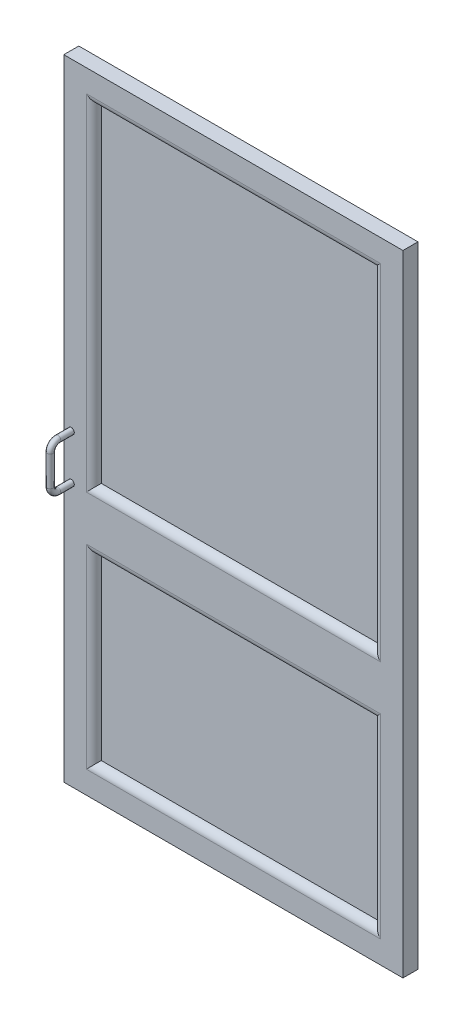
ISO-10303-21;
HEADER;
FILE_DESCRIPTION(('STEP AP214'),'2;1');
FILE_NAME('part.step','',(''),(''),'','','');
FILE_SCHEMA(('AUTOMOTIVE_DESIGN { 1 0 10303 214 1 1 1 1 }'));
ENDSEC;
DATA;
#1=APPLICATION_CONTEXT('core data for automotive mechanical design processes');
#2=APPLICATION_PROTOCOL_DEFINITION('international standard','automotive_design',2000,#1);
#3=PRODUCT_CONTEXT('',#1,'mechanical');
#4=PRODUCT('Part','Part','',(#3));
#5=PRODUCT_RELATED_PRODUCT_CATEGORY('part','',(#4));
#6=PRODUCT_DEFINITION_FORMATION('','',#4);
#7=PRODUCT_DEFINITION_CONTEXT('part definition',#1,'design');
#8=PRODUCT_DEFINITION('design','',#6,#7);
#9=PRODUCT_DEFINITION_SHAPE('','',#8);
#10=(LENGTH_UNIT() NAMED_UNIT(*) SI_UNIT(.MILLI.,.METRE.));
#11=(NAMED_UNIT(*) PLANE_ANGLE_UNIT() SI_UNIT($,.RADIAN.));
#12=(NAMED_UNIT(*) SI_UNIT($,.STERADIAN.) SOLID_ANGLE_UNIT());
#13=UNCERTAINTY_MEASURE_WITH_UNIT(LENGTH_MEASURE(1.E-05),#10,'distance_accuracy_value','');
#14=(GEOMETRIC_REPRESENTATION_CONTEXT(3) GLOBAL_UNCERTAINTY_ASSIGNED_CONTEXT((#13)) GLOBAL_UNIT_ASSIGNED_CONTEXT((#10,
#11,#12)) REPRESENTATION_CONTEXT('',''));
#15=CARTESIAN_POINT('',(0.,0.,0.));
#16=DIRECTION('',(0.,0.,1.));
#17=DIRECTION('',(1.,0.,0.));
#18=AXIS2_PLACEMENT_3D('',#15,#16,#17);
#19=CARTESIAN_POINT('',(0.,0.,4.));
#20=DIRECTION('',(0.,0.,-1.));
#21=DIRECTION('',(-1.,0.,0.));
#22=AXIS2_PLACEMENT_3D('',#19,#20,#21);
#23=PLANE('',#22);
#24=DIRECTION('',(0.,-1.,0.));
#25=VECTOR('',#24,1.);
#26=CARTESIAN_POINT('',(0.,0.,4.));
#27=LINE('',#26,#25);
#28=CARTESIAN_POINT('',(0.,168.,4.));
#29=VERTEX_POINT('',#28);
#30=CARTESIAN_POINT('',(0.,0.,4.));
#31=VERTEX_POINT('',#30);
#32=EDGE_CURVE('E164',#29,#31,#27,.T.);
#33=ORIENTED_EDGE('',*,*,#32,.T.);
#34=DIRECTION('',(1.,0.,0.));
#35=VECTOR('',#34,1.);
#36=CARTESIAN_POINT('',(0.,0.,4.));
#37=LINE('',#36,#35);
#38=CARTESIAN_POINT('',(90.4342659726487,0.,4.));
#39=VERTEX_POINT('',#38);
#40=EDGE_CURVE('E167',#31,#39,#37,.T.);
#41=ORIENTED_EDGE('',*,*,#40,.T.);
#42=DIRECTION('',(0.,1.,0.));
#43=VECTOR('',#42,1.);
#44=CARTESIAN_POINT('',(90.4342659726487,0.,4.));
#45=LINE('',#44,#43);
#46=CARTESIAN_POINT('',(90.4342659726487,168.,4.));
#47=VERTEX_POINT('',#46);
#48=EDGE_CURVE('E170',#39,#47,#45,.T.);
#49=ORIENTED_EDGE('',*,*,#48,.T.);
#50=DIRECTION('',(-1.,0.,0.));
#51=VECTOR('',#50,1.);
#52=CARTESIAN_POINT('',(0.,168.,4.));
#53=LINE('',#52,#51);
#54=EDGE_CURVE('E172',#47,#29,#53,.T.);
#55=ORIENTED_EDGE('',*,*,#54,.T.);
#56=EDGE_LOOP('',(#33,#41,#49,#55));
#57=FACE_BOUND('',#56,.T.);
#58=DIRECTION('',(1.,0.,0.));
#59=VECTOR('',#58,1.);
#60=CARTESIAN_POINT('',(0.,70.,4.));
#61=LINE('',#60,#59);
#62=CARTESIAN_POINT('',(84.4342659726486,70.,4.));
#63=VERTEX_POINT('',#62);
#64=CARTESIAN_POINT('',(6.,70.,4.));
#65=VERTEX_POINT('',#64);
#66=EDGE_CURVE('E197',#63,#65,#61,.F.);
#67=ORIENTED_EDGE('',*,*,#66,.T.);
#68=DIRECTION('',(0.,-1.,0.));
#69=VECTOR('',#68,1.);
#70=CARTESIAN_POINT('',(6.00000000000001,0.,4.));
#71=LINE('',#70,#69);
#72=CARTESIAN_POINT('',(5.99999999999999,162.,4.));
#73=VERTEX_POINT('',#72);
#74=EDGE_CURVE('E199',#65,#73,#71,.F.);
#75=ORIENTED_EDGE('',*,*,#74,.T.);
#76=DIRECTION('',(-1.,0.,0.));
#77=VECTOR('',#76,1.);
#78=CARTESIAN_POINT('',(0.,162.,4.));
#79=LINE('',#78,#77);
#80=CARTESIAN_POINT('',(84.4342659726486,162.,4.));
#81=VERTEX_POINT('',#80);
#82=EDGE_CURVE('E193',#73,#81,#79,.F.);
#83=ORIENTED_EDGE('',*,*,#82,.T.);
#84=DIRECTION('',(0.,1.,0.));
#85=VECTOR('',#84,1.);
#86=CARTESIAN_POINT('',(84.4342659726487,0.,4.));
#87=LINE('',#86,#85);
#88=EDGE_CURVE('E195',#81,#63,#87,.F.);
#89=ORIENTED_EDGE('',*,*,#88,.T.);
#90=EDGE_LOOP('',(#67,#75,#83,#89));
#91=FACE_BOUND('',#90,.T.);
#92=DIRECTION('',(0.,1.,0.));
#93=VECTOR('',#92,1.);
#94=CARTESIAN_POINT('',(84.4342659726486,0.,4.));
#95=LINE('',#94,#93);
#96=CARTESIAN_POINT('',(84.4342659726486,58.,4.));
#97=VERTEX_POINT('',#96);
#98=CARTESIAN_POINT('',(84.4342659726486,6.,4.));
#99=VERTEX_POINT('',#98);
#100=EDGE_CURVE('E62',#97,#99,#95,.F.);
#101=ORIENTED_EDGE('',*,*,#100,.T.);
#102=DIRECTION('',(1.,0.,0.));
#103=VECTOR('',#102,1.);
#104=CARTESIAN_POINT('',(0.,6.,4.));
#105=LINE('',#104,#103);
#106=CARTESIAN_POINT('',(6.00000000000001,6.,4.));
#107=VERTEX_POINT('',#106);
#108=EDGE_CURVE('E46',#99,#107,#105,.F.);
#109=ORIENTED_EDGE('',*,*,#108,.T.);
#110=DIRECTION('',(0.,-1.,0.));
#111=VECTOR('',#110,1.);
#112=CARTESIAN_POINT('',(6.00000000000001,0.,4.));
#113=LINE('',#112,#111);
#114=CARTESIAN_POINT('',(6.,58.,4.));
#115=VERTEX_POINT('',#114);
#116=EDGE_CURVE('E141',#107,#115,#113,.F.);
#117=ORIENTED_EDGE('',*,*,#116,.T.);
#118=DIRECTION('',(-1.,0.,0.));
#119=VECTOR('',#118,1.);
#120=CARTESIAN_POINT('',(0.,58.,4.));
#121=LINE('',#120,#119);
#122=EDGE_CURVE('E202',#115,#97,#121,.F.);
#123=ORIENTED_EDGE('',*,*,#122,.T.);
#124=EDGE_LOOP('',(#101,#109,#117,#123));
#125=FACE_BOUND('',#124,.T.);
#126=CARTESIAN_POINT('',(2.,70.1108439341889,4.));
#127=DIRECTION('',(0.,0.,-1.));
#128=DIRECTION('',(-1.,0.,0.));
#129=AXIS2_PLACEMENT_3D('',#126,#127,#128);
#130=CIRCLE('',#129,0.8);
#131=CARTESIAN_POINT('',(1.2,70.1108439341889,4.));
#132=VERTEX_POINT('',#131);
#133=EDGE_CURVE('E41',#132,#132,#130,.T.);
#134=ORIENTED_EDGE('',*,*,#133,.T.);
#135=EDGE_LOOP('',(#134));
#136=FACE_BOUND('',#135,.T.);
#137=CARTESIAN_POINT('',(2.,82.1108439341888,4.));
#138=DIRECTION('',(0.,0.,1.));
#139=DIRECTION('',(1.,0.,0.));
#140=AXIS2_PLACEMENT_3D('',#137,#138,#139);
#141=CIRCLE('',#140,0.8);
#142=CARTESIAN_POINT('',(2.8,82.1108439341888,4.));
#143=VERTEX_POINT('',#142);
#144=EDGE_CURVE('E11',#143,#143,#141,.T.);
#145=ORIENTED_EDGE('',*,*,#144,.F.);
#146=EDGE_LOOP('',(#145));
#147=FACE_BOUND('',#146,.T.);
#148=ADVANCED_FACE('F37',(#57,#91,#125,#136,#147),#23,.F.);
#149=CARTESIAN_POINT('',(0.,0.,4.));
#150=DIRECTION('',(1.,0.,0.));
#151=DIRECTION('',(0.,0.,-1.));
#152=AXIS2_PLACEMENT_3D('',#149,#150,#151);
#153=PLANE('',#152);
#154=DIRECTION('',(0.,-1.,0.));
#155=VECTOR('',#154,1.);
#156=CARTESIAN_POINT('',(0.,0.,0.));
#157=LINE('',#156,#155);
#158=CARTESIAN_POINT('',(0.,168.,0.));
#159=VERTEX_POINT('',#158);
#160=CARTESIAN_POINT('',(0.,0.,0.));
#161=VERTEX_POINT('',#160);
#162=EDGE_CURVE('E154',#159,#161,#157,.T.);
#163=ORIENTED_EDGE('',*,*,#162,.T.);
#164=DIRECTION('',(0.,0.,-1.));
#165=VECTOR('',#164,1.);
#166=CARTESIAN_POINT('',(0.,0.,4.));
#167=LINE('',#166,#165);
#168=EDGE_CURVE('E190',#31,#161,#167,.T.);
#169=ORIENTED_EDGE('',*,*,#168,.F.);
#170=ORIENTED_EDGE('',*,*,#32,.F.);
#171=DIRECTION('',(0.,0.,-1.));
#172=VECTOR('',#171,1.);
#173=CARTESIAN_POINT('',(0.,168.,4.));
#174=LINE('',#173,#172);
#175=EDGE_CURVE('E174',#29,#159,#174,.T.);
#176=ORIENTED_EDGE('',*,*,#175,.T.);
#177=EDGE_LOOP('',(#163,#169,#170,#176));
#178=FACE_BOUND('',#177,.T.);
#179=ADVANCED_FACE('F255',(#178),#153,.F.);
#180=CARTESIAN_POINT('',(0.,0.,4.));
#181=DIRECTION('',(0.,1.,0.));
#182=DIRECTION('',(0.,0.,1.));
#183=AXIS2_PLACEMENT_3D('',#180,#181,#182);
#184=PLANE('',#183);
#185=DIRECTION('',(1.,0.,0.));
#186=VECTOR('',#185,1.);
#187=CARTESIAN_POINT('',(0.,0.,0.));
#188=LINE('',#187,#186);
#189=CARTESIAN_POINT('',(90.4342659726487,0.,0.));
#190=VERTEX_POINT('',#189);
#191=EDGE_CURVE('E177',#161,#190,#188,.T.);
#192=ORIENTED_EDGE('',*,*,#191,.T.);
#193=DIRECTION('',(0.,0.,-1.));
#194=VECTOR('',#193,1.);
#195=CARTESIAN_POINT('',(90.4342659726487,0.,4.));
#196=LINE('',#195,#194);
#197=EDGE_CURVE('E187',#39,#190,#196,.T.);
#198=ORIENTED_EDGE('',*,*,#197,.F.);
#199=ORIENTED_EDGE('',*,*,#40,.F.);
#200=ORIENTED_EDGE('',*,*,#168,.T.);
#201=EDGE_LOOP('',(#192,#198,#199,#200));
#202=FACE_BOUND('',#201,.T.);
#203=ADVANCED_FACE('F260',(#202),#184,.F.);
#204=CARTESIAN_POINT('',(90.4342659726487,0.,4.));
#205=DIRECTION('',(-1.,0.,0.));
#206=DIRECTION('',(0.,0.,1.));
#207=AXIS2_PLACEMENT_3D('',#204,#205,#206);
#208=PLANE('',#207);
#209=DIRECTION('',(0.,1.,0.));
#210=VECTOR('',#209,1.);
#211=CARTESIAN_POINT('',(90.4342659726487,0.,0.));
#212=LINE('',#211,#210);
#213=CARTESIAN_POINT('',(90.4342659726487,168.,0.));
#214=VERTEX_POINT('',#213);
#215=EDGE_CURVE('E179',#190,#214,#212,.T.);
#216=ORIENTED_EDGE('',*,*,#215,.T.);
#217=DIRECTION('',(0.,0.,-1.));
#218=VECTOR('',#217,1.);
#219=CARTESIAN_POINT('',(90.4342659726487,168.,4.));
#220=LINE('',#219,#218);
#221=EDGE_CURVE('E184',#47,#214,#220,.T.);
#222=ORIENTED_EDGE('',*,*,#221,.F.);
#223=ORIENTED_EDGE('',*,*,#48,.F.);
#224=ORIENTED_EDGE('',*,*,#197,.T.);
#225=EDGE_LOOP('',(#216,#222,#223,#224));
#226=FACE_BOUND('',#225,.T.);
#227=ADVANCED_FACE('F266',(#226),#208,.F.);
#228=CARTESIAN_POINT('',(0.,168.,4.));
#229=DIRECTION('',(0.,-1.,0.));
#230=DIRECTION('',(0.,0.,-1.));
#231=AXIS2_PLACEMENT_3D('',#228,#229,#230);
#232=PLANE('',#231);
#233=DIRECTION('',(-1.,0.,0.));
#234=VECTOR('',#233,1.);
#235=CARTESIAN_POINT('',(0.,168.,0.));
#236=LINE('',#235,#234);
#237=EDGE_CURVE('E168',#214,#159,#236,.T.);
#238=ORIENTED_EDGE('',*,*,#237,.T.);
#239=ORIENTED_EDGE('',*,*,#175,.F.);
#240=ORIENTED_EDGE('',*,*,#54,.F.);
#241=ORIENTED_EDGE('',*,*,#221,.T.);
#242=EDGE_LOOP('',(#238,#239,#240,#241));
#243=FACE_BOUND('',#242,.T.);
#244=ADVANCED_FACE('F250',(#243),#232,.F.);
#245=CARTESIAN_POINT('',(0.,0.,0.));
#246=DIRECTION('',(0.,0.,-1.));
#247=DIRECTION('',(-1.,0.,0.));
#248=AXIS2_PLACEMENT_3D('',#245,#246,#247);
#249=PLANE('',#248);
#250=ORIENTED_EDGE('',*,*,#162,.F.);
#251=ORIENTED_EDGE('',*,*,#237,.F.);
#252=ORIENTED_EDGE('',*,*,#215,.F.);
#253=ORIENTED_EDGE('',*,*,#191,.F.);
#254=EDGE_LOOP('',(#250,#251,#252,#253));
#255=FACE_BOUND('',#254,.T.);
#256=ADVANCED_FACE('F242',(#255),#249,.T.);
#257=CARTESIAN_POINT('',(0.,0.,2.));
#258=DIRECTION('',(0.,0.,1.));
#259=DIRECTION('',(1.,0.,0.));
#260=AXIS2_PLACEMENT_3D('',#257,#258,#259);
#261=PLANE('',#260);
#262=DIRECTION('',(0.,-1.,0.));
#263=VECTOR('',#262,1.);
#264=CARTESIAN_POINT('',(7.99999999999999,160.,2.));
#265=LINE('',#264,#263);
#266=CARTESIAN_POINT('',(7.99999999999999,160.,2.));
#267=VERTEX_POINT('',#266);
#268=CARTESIAN_POINT('',(8.,72.,2.));
#269=VERTEX_POINT('',#268);
#270=EDGE_CURVE('E155',#267,#269,#265,.T.);
#271=ORIENTED_EDGE('',*,*,#270,.T.);
#272=DIRECTION('',(1.,0.,0.));
#273=VECTOR('',#272,1.);
#274=CARTESIAN_POINT('',(8.,72.,2.));
#275=LINE('',#274,#273);
#276=CARTESIAN_POINT('',(82.4342659726486,72.,2.));
#277=VERTEX_POINT('',#276);
#278=EDGE_CURVE('E158',#269,#277,#275,.T.);
#279=ORIENTED_EDGE('',*,*,#278,.T.);
#280=DIRECTION('',(0.,1.,0.));
#281=VECTOR('',#280,1.);
#282=CARTESIAN_POINT('',(82.4342659726486,160.,2.));
#283=LINE('',#282,#281);
#284=CARTESIAN_POINT('',(82.4342659726486,160.,2.));
#285=VERTEX_POINT('',#284);
#286=EDGE_CURVE('E161',#277,#285,#283,.T.);
#287=ORIENTED_EDGE('',*,*,#286,.T.);
#288=DIRECTION('',(-1.,0.,0.));
#289=VECTOR('',#288,1.);
#290=CARTESIAN_POINT('',(7.99999999999999,160.,2.));
#291=LINE('',#290,#289);
#292=EDGE_CURVE('E138',#285,#267,#291,.T.);
#293=ORIENTED_EDGE('',*,*,#292,.T.);
#294=EDGE_LOOP('',(#271,#279,#287,#293));
#295=FACE_BOUND('',#294,.T.);
#296=ADVANCED_FACE('F240',(#295),#261,.T.);
#297=CARTESIAN_POINT('',(0.,0.,2.));
#298=DIRECTION('',(0.,0.,1.));
#299=DIRECTION('',(1.,0.,0.));
#300=AXIS2_PLACEMENT_3D('',#297,#298,#299);
#301=PLANE('',#300);
#302=DIRECTION('',(0.,-1.,0.));
#303=VECTOR('',#302,1.);
#304=CARTESIAN_POINT('',(8.,56.,2.));
#305=LINE('',#304,#303);
#306=CARTESIAN_POINT('',(8.,56.,2.));
#307=VERTEX_POINT('',#306);
#308=CARTESIAN_POINT('',(8.00000000000001,8.,2.));
#309=VERTEX_POINT('',#308);
#310=EDGE_CURVE('E130',#307,#309,#305,.T.);
#311=ORIENTED_EDGE('',*,*,#310,.T.);
#312=DIRECTION('',(1.,0.,0.));
#313=VECTOR('',#312,1.);
#314=CARTESIAN_POINT('',(8.00000000000001,8.,2.));
#315=LINE('',#314,#313);
#316=CARTESIAN_POINT('',(82.4342659726486,8.,2.));
#317=VERTEX_POINT('',#316);
#318=EDGE_CURVE('E132',#309,#317,#315,.T.);
#319=ORIENTED_EDGE('',*,*,#318,.T.);
#320=DIRECTION('',(0.,1.,0.));
#321=VECTOR('',#320,1.);
#322=CARTESIAN_POINT('',(82.4342659726486,56.,2.));
#323=LINE('',#322,#321);
#324=CARTESIAN_POINT('',(82.4342659726486,56.,2.));
#325=VERTEX_POINT('',#324);
#326=EDGE_CURVE('E148',#317,#325,#323,.T.);
#327=ORIENTED_EDGE('',*,*,#326,.T.);
#328=DIRECTION('',(-1.,0.,0.));
#329=VECTOR('',#328,1.);
#330=CARTESIAN_POINT('',(8.,56.,2.));
#331=LINE('',#330,#329);
#332=EDGE_CURVE('E134',#325,#307,#331,.T.);
#333=ORIENTED_EDGE('',*,*,#332,.T.);
#334=EDGE_LOOP('',(#311,#319,#327,#333));
#335=FACE_BOUND('',#334,.T.);
#336=ADVANCED_FACE('F131',(#335),#301,.T.);
#337=CARTESIAN_POINT('',(8.,58.,2.));
#338=DIRECTION('',(-1.,0.,0.));
#339=DIRECTION('',(0.,0.,1.));
#340=AXIS2_PLACEMENT_3D('',#337,#338,#339);
#341=CYLINDRICAL_SURFACE('',#340,2.);
#342=CARTESIAN_POINT('',(84.4342659726486,58.,2.));
#343=DIRECTION('',(-0.707106781186547,0.707106781186547,0.));
#344=DIRECTION('',(0.707106781186547,0.707106781186547,0.));
#345=AXIS2_PLACEMENT_3D('',#342,#343,#344);
#346=ELLIPSE('',#345,2.82842712474619,2.);
#347=EDGE_CURVE('E142',#97,#325,#346,.F.);
#348=ORIENTED_EDGE('',*,*,#347,.F.);
#349=ORIENTED_EDGE('',*,*,#122,.F.);
#350=CARTESIAN_POINT('',(6.,58.,2.));
#351=DIRECTION('',(-0.707106781186547,-0.707106781186548,0.));
#352=DIRECTION('',(0.707106781186547,-0.707106781186547,0.));
#353=AXIS2_PLACEMENT_3D('',#350,#351,#352);
#354=ELLIPSE('',#353,2.82842712474619,2.);
#355=EDGE_CURVE('E159',#307,#115,#354,.T.);
#356=ORIENTED_EDGE('',*,*,#355,.F.);
#357=ORIENTED_EDGE('',*,*,#332,.F.);
#358=EDGE_LOOP('',(#348,#349,#356,#357));
#359=FACE_BOUND('',#358,.T.);
#360=ADVANCED_FACE('F248',(#359),#341,.T.);
#361=CARTESIAN_POINT('',(6.,56.,2.));
#362=DIRECTION('',(0.,-1.,0.));
#363=DIRECTION('',(1.,0.,0.));
#364=AXIS2_PLACEMENT_3D('',#361,#362,#363);
#365=CYLINDRICAL_SURFACE('',#364,2.);
#366=ORIENTED_EDGE('',*,*,#355,.T.);
#367=ORIENTED_EDGE('',*,*,#116,.F.);
#368=CARTESIAN_POINT('',(6.00000000000001,6.,2.));
#369=DIRECTION('',(0.707106781186547,-0.707106781186547,0.));
#370=DIRECTION('',(0.707106781186547,0.707106781186548,0.));
#371=AXIS2_PLACEMENT_3D('',#368,#369,#370);
#372=ELLIPSE('',#371,2.82842712474619,2.);
#373=EDGE_CURVE('E54',#309,#107,#372,.T.);
#374=ORIENTED_EDGE('',*,*,#373,.F.);
#375=ORIENTED_EDGE('',*,*,#310,.F.);
#376=EDGE_LOOP('',(#366,#367,#374,#375));
#377=FACE_BOUND('',#376,.T.);
#378=ADVANCED_FACE('F140',(#377),#365,.T.);
#379=CARTESIAN_POINT('',(84.4342659726486,56.,2.));
#380=DIRECTION('',(0.,1.,0.));
#381=DIRECTION('',(0.,0.,1.));
#382=AXIS2_PLACEMENT_3D('',#379,#380,#381);
#383=CYLINDRICAL_SURFACE('',#382,2.);
#384=ORIENTED_EDGE('',*,*,#347,.T.);
#385=ORIENTED_EDGE('',*,*,#326,.F.);
#386=CARTESIAN_POINT('',(84.4342659726486,6.,2.));
#387=DIRECTION('',(0.707106781186547,0.707106781186547,0.));
#388=DIRECTION('',(0.707106781186547,-0.707106781186547,0.));
#389=AXIS2_PLACEMENT_3D('',#386,#387,#388);
#390=ELLIPSE('',#389,2.82842712474619,2.);
#391=EDGE_CURVE('E143',#99,#317,#390,.F.);
#392=ORIENTED_EDGE('',*,*,#391,.F.);
#393=ORIENTED_EDGE('',*,*,#100,.F.);
#394=EDGE_LOOP('',(#384,#385,#392,#393));
#395=FACE_BOUND('',#394,.T.);
#396=ADVANCED_FACE('F276',(#395),#383,.T.);
#397=CARTESIAN_POINT('',(8.00000000000001,6.,2.));
#398=DIRECTION('',(1.,0.,0.));
#399=DIRECTION('',(0.,0.,-1.));
#400=AXIS2_PLACEMENT_3D('',#397,#398,#399);
#401=CYLINDRICAL_SURFACE('',#400,2.);
#402=ORIENTED_EDGE('',*,*,#373,.T.);
#403=ORIENTED_EDGE('',*,*,#108,.F.);
#404=ORIENTED_EDGE('',*,*,#391,.T.);
#405=ORIENTED_EDGE('',*,*,#318,.F.);
#406=EDGE_LOOP('',(#402,#403,#404,#405));
#407=FACE_BOUND('',#406,.T.);
#408=ADVANCED_FACE('F145',(#407),#401,.T.);
#409=CARTESIAN_POINT('',(84.4342659726486,160.,2.));
#410=DIRECTION('',(0.,1.,0.));
#411=DIRECTION('',(-1.,0.,0.));
#412=AXIS2_PLACEMENT_3D('',#409,#410,#411);
#413=CYLINDRICAL_SURFACE('',#412,2.);
#414=CARTESIAN_POINT('',(84.4342659726486,70.,2.));
#415=DIRECTION('',(0.707106781186547,0.707106781186548,0.));
#416=DIRECTION('',(0.707106781186548,-0.707106781186547,0.));
#417=AXIS2_PLACEMENT_3D('',#414,#415,#416);
#418=ELLIPSE('',#417,2.82842712474619,2.);
#419=EDGE_CURVE('E216',#63,#277,#418,.F.);
#420=ORIENTED_EDGE('',*,*,#419,.F.);
#421=ORIENTED_EDGE('',*,*,#88,.F.);
#422=CARTESIAN_POINT('',(84.4342659726486,162.,2.));
#423=DIRECTION('',(-0.707106781186548,0.707106781186547,0.));
#424=DIRECTION('',(0.707106781186547,0.707106781186548,0.));
#425=AXIS2_PLACEMENT_3D('',#422,#423,#424);
#426=ELLIPSE('',#425,2.82842712474619,2.);
#427=EDGE_CURVE('E207',#285,#81,#426,.T.);
#428=ORIENTED_EDGE('',*,*,#427,.F.);
#429=ORIENTED_EDGE('',*,*,#286,.F.);
#430=EDGE_LOOP('',(#420,#421,#428,#429));
#431=FACE_BOUND('',#430,.T.);
#432=ADVANCED_FACE('F39',(#431),#413,.T.);
#433=CARTESIAN_POINT('',(7.99999999999999,162.,2.));
#434=DIRECTION('',(-1.,0.,0.));
#435=DIRECTION('',(0.,0.,1.));
#436=AXIS2_PLACEMENT_3D('',#433,#434,#435);
#437=CYLINDRICAL_SURFACE('',#436,2.);
#438=ORIENTED_EDGE('',*,*,#427,.T.);
#439=ORIENTED_EDGE('',*,*,#82,.F.);
#440=CARTESIAN_POINT('',(5.99999999999999,162.,2.));
#441=DIRECTION('',(-0.707106781186547,-0.707106781186548,0.));
#442=DIRECTION('',(0.707106781186548,-0.707106781186547,0.));
#443=AXIS2_PLACEMENT_3D('',#440,#441,#442);
#444=ELLIPSE('',#443,2.82842712474619,2.);
#445=EDGE_CURVE('E214',#267,#73,#444,.T.);
#446=ORIENTED_EDGE('',*,*,#445,.F.);
#447=ORIENTED_EDGE('',*,*,#292,.F.);
#448=EDGE_LOOP('',(#438,#439,#446,#447));
#449=FACE_BOUND('',#448,.T.);
#450=ADVANCED_FACE('F223',(#449),#437,.T.);
#451=CARTESIAN_POINT('',(8.,70.,2.));
#452=DIRECTION('',(1.,0.,0.));
#453=DIRECTION('',(0.,0.,-1.));
#454=AXIS2_PLACEMENT_3D('',#451,#452,#453);
#455=CYLINDRICAL_SURFACE('',#454,2.);
#456=ORIENTED_EDGE('',*,*,#419,.T.);
#457=ORIENTED_EDGE('',*,*,#278,.F.);
#458=CARTESIAN_POINT('',(6.,70.,2.));
#459=DIRECTION('',(0.707106781186548,-0.707106781186547,0.));
#460=DIRECTION('',(-0.707106781186547,-0.707106781186548,0.));
#461=AXIS2_PLACEMENT_3D('',#458,#459,#460);
#462=ELLIPSE('',#461,2.82842712474619,2.);
#463=EDGE_CURVE('E212',#65,#269,#462,.F.);
#464=ORIENTED_EDGE('',*,*,#463,.F.);
#465=ORIENTED_EDGE('',*,*,#66,.F.);
#466=EDGE_LOOP('',(#456,#457,#464,#465));
#467=FACE_BOUND('',#466,.T.);
#468=ADVANCED_FACE('F238',(#467),#455,.T.);
#469=CARTESIAN_POINT('',(5.99999999999999,160.,2.));
#470=DIRECTION('',(0.,-1.,0.));
#471=DIRECTION('',(1.,0.,0.));
#472=AXIS2_PLACEMENT_3D('',#469,#470,#471);
#473=CYLINDRICAL_SURFACE('',#472,2.);
#474=ORIENTED_EDGE('',*,*,#445,.T.);
#475=ORIENTED_EDGE('',*,*,#74,.F.);
#476=ORIENTED_EDGE('',*,*,#463,.T.);
#477=ORIENTED_EDGE('',*,*,#270,.F.);
#478=EDGE_LOOP('',(#474,#475,#476,#477));
#479=FACE_BOUND('',#478,.T.);
#480=ADVANCED_FACE('F234',(#479),#473,.T.);
#481=CARTESIAN_POINT('',(2.,70.1108439341889,7.59999999999999));
#482=DIRECTION('',(0.,0.,-1.));
#483=DIRECTION('',(-1.,0.,0.));
#484=AXIS2_PLACEMENT_3D('',#481,#482,#483);
#485=CYLINDRICAL_SURFACE('',#484,0.8);
#486=CARTESIAN_POINT('',(2.,70.1108439341888,7.59999999999999));
#487=DIRECTION('',(0.,0.,-1.));
#488=DIRECTION('',(1.,0.,0.));
#489=AXIS2_PLACEMENT_3D('',#486,#487,#488);
#490=CIRCLE('',#489,0.8);
#491=CARTESIAN_POINT('',(2.,69.3108439341889,7.59999999999998));
#492=VERTEX_POINT('',#491);
#493=EDGE_CURVE('E445',#492,#492,#490,.T.);
#494=ORIENTED_EDGE('',*,*,#493,.T.);
#495=EDGE_LOOP('',(#494));
#496=FACE_BOUND('',#495,.T.);
#497=ORIENTED_EDGE('',*,*,#133,.F.);
#498=EDGE_LOOP('',(#497));
#499=FACE_BOUND('',#498,.T.);
#500=ADVANCED_FACE('F287',(#496,#499),#485,.T.);
#501=CARTESIAN_POINT('',(2.,82.1108439341888,4.));
#502=DIRECTION('',(0.,0.,1.));
#503=DIRECTION('',(1.,0.,0.));
#504=AXIS2_PLACEMENT_3D('',#501,#502,#503);
#505=CYLINDRICAL_SURFACE('',#504,0.8);
#506=CARTESIAN_POINT('',(2.,82.1108439341888,7.59999999999999));
#507=DIRECTION('',(0.,0.,1.));
#508=DIRECTION('',(1.,0.,0.));
#509=AXIS2_PLACEMENT_3D('',#506,#507,#508);
#510=CIRCLE('',#509,0.8);
#511=CARTESIAN_POINT('',(2.,82.9108439341888,7.59999999999998));
#512=VERTEX_POINT('',#511);
#513=EDGE_CURVE('E452',#512,#512,#510,.T.);
#514=ORIENTED_EDGE('',*,*,#513,.F.);
#515=EDGE_LOOP('',(#514));
#516=FACE_BOUND('',#515,.T.);
#517=ORIENTED_EDGE('',*,*,#144,.T.);
#518=EDGE_LOOP('',(#517));
#519=FACE_BOUND('',#518,.T.);
#520=ADVANCED_FACE('F369',(#516,#519),#505,.T.);
#521=CARTESIAN_POINT('',(2.,80.1108439341888,7.6));
#522=DIRECTION('',(1.,0.,0.));
#523=DIRECTION('',(0.,0.,-1.));
#524=AXIS2_PLACEMENT_3D('',#521,#522,#523);
#525=TOROIDAL_SURFACE('',#524,1.99999999999996,0.8);
#526=CARTESIAN_POINT('',(2.,80.1108439341888,9.6));
#527=DIRECTION('',(0.,-1.,0.));
#528=DIRECTION('',(1.,0.,0.));
#529=AXIS2_PLACEMENT_3D('',#526,#527,#528);
#530=CIRCLE('',#529,0.8);
#531=CARTESIAN_POINT('',(2.,80.1108439341888,10.4));
#532=VERTEX_POINT('',#531);
#533=EDGE_CURVE('E449',#532,#532,#530,.T.);
#534=CARTESIAN_POINT('',(2.,80.1108439341888,7.6));
#535=DIRECTION('',(1.,0.,0.));
#536=DIRECTION('',(0.,0.,-1.));
#537=AXIS2_PLACEMENT_3D('',#534,#535,#536);
#538=CIRCLE('',#537,2.79999999999996);
#539=EDGE_CURVE('',#512,#532,#538,.T.);
#540=ORIENTED_EDGE('',*,*,#513,.T.);
#541=ORIENTED_EDGE('',*,*,#533,.F.);
#542=ORIENTED_EDGE('',*,*,#539,.T.);
#543=ORIENTED_EDGE('',*,*,#539,.F.);
#544=EDGE_LOOP('',(#540,#542,#541,#543));
#545=FACE_BOUND('',#544,.T.);
#546=ADVANCED_FACE('F381',(#545),#525,.T.);
#547=CARTESIAN_POINT('',(2.,80.1108439341888,9.6));
#548=DIRECTION('',(0.,-1.,0.));
#549=DIRECTION('',(0.,0.,-1.));
#550=AXIS2_PLACEMENT_3D('',#547,#548,#549);
#551=CYLINDRICAL_SURFACE('',#550,0.8);
#552=CARTESIAN_POINT('',(2.,72.1108439341889,9.6));
#553=DIRECTION('',(0.,-1.,0.));
#554=DIRECTION('',(1.,0.,0.));
#555=AXIS2_PLACEMENT_3D('',#552,#553,#554);
#556=CIRCLE('',#555,0.8);
#557=CARTESIAN_POINT('',(2.,72.1108439341889,10.4));
#558=VERTEX_POINT('',#557);
#559=EDGE_CURVE('E448',#558,#558,#556,.T.);
#560=ORIENTED_EDGE('',*,*,#559,.F.);
#561=EDGE_LOOP('',(#560));
#562=FACE_BOUND('',#561,.T.);
#563=ORIENTED_EDGE('',*,*,#533,.T.);
#564=EDGE_LOOP('',(#563));
#565=FACE_BOUND('',#564,.T.);
#566=ADVANCED_FACE('F391',(#562,#565),#551,.T.);
#567=CARTESIAN_POINT('',(2.,72.1108439341888,7.6));
#568=DIRECTION('',(1.,0.,0.));
#569=DIRECTION('',(0.,0.,-1.));
#570=AXIS2_PLACEMENT_3D('',#567,#568,#569);
#571=TOROIDAL_SURFACE('',#570,2.,0.8);
#572=CARTESIAN_POINT('',(2.,72.1108439341888,7.6));
#573=DIRECTION('',(1.,0.,0.));
#574=DIRECTION('',(0.,0.,-1.));
#575=AXIS2_PLACEMENT_3D('',#572,#573,#574);
#576=CIRCLE('',#575,2.8);
#577=EDGE_CURVE('',#558,#492,#576,.T.);
#578=ORIENTED_EDGE('',*,*,#559,.T.);
#579=ORIENTED_EDGE('',*,*,#493,.F.);
#580=ORIENTED_EDGE('',*,*,#577,.T.);
#581=ORIENTED_EDGE('',*,*,#577,.F.);
#582=EDGE_LOOP('',(#578,#580,#579,#581));
#583=FACE_BOUND('',#582,.T.);
#584=ADVANCED_FACE('F372',(#583),#571,.T.);
#585=CLOSED_SHELL('',(#148,#179,#203,#227,#244,#256,#296,#336,#360,#378,#396,#408,#432,#450,
#468,#480,#500,#520,#546,#566,#584));
#586=MANIFOLD_SOLID_BREP('B2',#585);
#587=ADVANCED_BREP_SHAPE_REPRESENTATION('',(#18,#586),#14);
#588=SHAPE_DEFINITION_REPRESENTATION(#9,#587);
ENDSEC;
END-ISO-10303-21;
